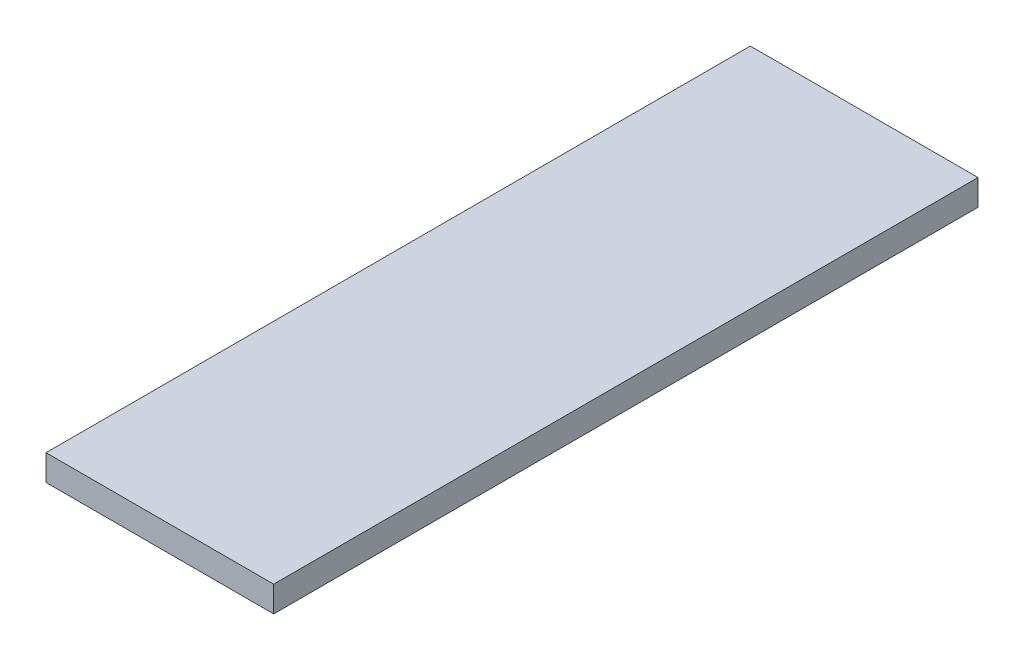
ISO-10303-21;
HEADER;
FILE_DESCRIPTION(('STEP AP214'),'2;1');
FILE_NAME('part.step','',(''),(''),'','','');
FILE_SCHEMA(('AUTOMOTIVE_DESIGN { 1 0 10303 214 1 1 1 1 }'));
ENDSEC;
DATA;
#1=APPLICATION_CONTEXT('core data for automotive mechanical design processes');
#2=APPLICATION_PROTOCOL_DEFINITION('international standard','automotive_design',2000,#1);
#3=PRODUCT_CONTEXT('',#1,'mechanical');
#4=PRODUCT('Part','Part','',(#3));
#5=PRODUCT_RELATED_PRODUCT_CATEGORY('part','',(#4));
#6=PRODUCT_DEFINITION_FORMATION('','',#4);
#7=PRODUCT_DEFINITION_CONTEXT('part definition',#1,'design');
#8=PRODUCT_DEFINITION('design','',#6,#7);
#9=PRODUCT_DEFINITION_SHAPE('','',#8);
#10=(LENGTH_UNIT() NAMED_UNIT(*) SI_UNIT(.MILLI.,.METRE.));
#11=(NAMED_UNIT(*) PLANE_ANGLE_UNIT() SI_UNIT($,.RADIAN.));
#12=(NAMED_UNIT(*) SI_UNIT($,.STERADIAN.) SOLID_ANGLE_UNIT());
#13=UNCERTAINTY_MEASURE_WITH_UNIT(LENGTH_MEASURE(1.E-05),#10,'distance_accuracy_value','');
#14=(GEOMETRIC_REPRESENTATION_CONTEXT(3) GLOBAL_UNCERTAINTY_ASSIGNED_CONTEXT((#13)) GLOBAL_UNIT_ASSIGNED_CONTEXT((#10,
#11,#12)) REPRESENTATION_CONTEXT('',''));
#15=CARTESIAN_POINT('',(0.,0.,0.));
#16=DIRECTION('',(0.,0.,1.));
#17=DIRECTION('',(1.,0.,0.));
#18=AXIS2_PLACEMENT_3D('',#15,#16,#17);
#19=CARTESIAN_POINT('',(0.,0.,0.));
#20=DIRECTION('',(0.,0.,-1.));
#21=DIRECTION('',(-1.,0.,0.));
#22=AXIS2_PLACEMENT_3D('',#19,#20,#21);
#23=PLANE('',#22);
#24=DIRECTION('',(0.,1.,0.));
#25=VECTOR('',#24,1.);
#26=CARTESIAN_POINT('',(230.,-383.5,0.));
#27=LINE('',#26,#25);
#28=CARTESIAN_POINT('',(230.,-400.5,0.));
#29=VERTEX_POINT('',#28);
#30=CARTESIAN_POINT('',(230.,-383.5,0.));
#31=VERTEX_POINT('',#30);
#32=EDGE_CURVE('E82',#29,#31,#27,.T.);
#33=ORIENTED_EDGE('',*,*,#32,.F.);
#34=DIRECTION('',(1.,0.,0.));
#35=VECTOR('',#34,1.);
#36=CARTESIAN_POINT('',(230.,-400.5,0.));
#37=LINE('',#36,#35);
#38=CARTESIAN_POINT('',(80.,-400.5,0.));
#39=VERTEX_POINT('',#38);
#40=EDGE_CURVE('E93',#39,#29,#37,.T.);
#41=ORIENTED_EDGE('',*,*,#40,.F.);
#42=DIRECTION('',(0.,-1.,0.));
#43=VECTOR('',#42,1.);
#44=CARTESIAN_POINT('',(79.9999999999999,-383.5,0.));
#45=LINE('',#44,#43);
#46=CARTESIAN_POINT('',(79.9999999999999,-383.5,0.));
#47=VERTEX_POINT('',#46);
#48=EDGE_CURVE('E84',#47,#39,#45,.T.);
#49=ORIENTED_EDGE('',*,*,#48,.F.);
#50=DIRECTION('',(-1.,0.,0.));
#51=VECTOR('',#50,1.);
#52=CARTESIAN_POINT('',(230.,-383.5,0.));
#53=LINE('',#52,#51);
#54=EDGE_CURVE('E74',#31,#47,#53,.T.);
#55=ORIENTED_EDGE('',*,*,#54,.F.);
#56=EDGE_LOOP('',(#33,#41,#49,#55));
#57=FACE_BOUND('',#56,.T.);
#58=ADVANCED_FACE('F33',(#57),#23,.T.);
#59=CARTESIAN_POINT('',(230.,-400.5,614.960259671213));
#60=DIRECTION('',(0.,1.,0.));
#61=DIRECTION('',(0.,0.,1.));
#62=AXIS2_PLACEMENT_3D('',#59,#60,#61);
#63=PLANE('',#62);
#64=DIRECTION('',(0.,0.,-1.));
#65=VECTOR('',#64,1.);
#66=CARTESIAN_POINT('',(230.,-400.5,614.960259671213));
#67=LINE('',#66,#65);
#68=CARTESIAN_POINT('',(230.,-400.5,464.));
#69=VERTEX_POINT('',#68);
#70=EDGE_CURVE('E87',#69,#29,#67,.T.);
#71=ORIENTED_EDGE('',*,*,#70,.F.);
#72=DIRECTION('',(-1.,0.,0.));
#73=VECTOR('',#72,1.);
#74=CARTESIAN_POINT('',(230.,-400.5,464.));
#75=LINE('',#74,#73);
#76=CARTESIAN_POINT('',(80.,-400.5,464.));
#77=VERTEX_POINT('',#76);
#78=EDGE_CURVE('E37',#69,#77,#75,.T.);
#79=ORIENTED_EDGE('',*,*,#78,.T.);
#80=DIRECTION('',(0.,0.,-1.));
#81=VECTOR('',#80,1.);
#82=CARTESIAN_POINT('',(80.,-400.5,614.960259671213));
#83=LINE('',#82,#81);
#84=EDGE_CURVE('E96',#77,#39,#83,.T.);
#85=ORIENTED_EDGE('',*,*,#84,.T.);
#86=ORIENTED_EDGE('',*,*,#40,.T.);
#87=EDGE_LOOP('',(#71,#79,#85,#86));
#88=FACE_BOUND('',#87,.T.);
#89=ADVANCED_FACE('F106',(#88),#63,.F.);
#90=CARTESIAN_POINT('',(79.9999999999999,-383.5,614.960259671213));
#91=DIRECTION('',(1.,0.,0.));
#92=DIRECTION('',(0.,1.,0.));
#93=AXIS2_PLACEMENT_3D('',#90,#91,#92);
#94=PLANE('',#93);
#95=ORIENTED_EDGE('',*,*,#84,.F.);
#96=DIRECTION('',(0.,1.,0.));
#97=VECTOR('',#96,1.);
#98=CARTESIAN_POINT('',(79.9999999999999,-383.5,464.));
#99=LINE('',#98,#97);
#100=CARTESIAN_POINT('',(79.9999999999999,-383.5,464.));
#101=VERTEX_POINT('',#100);
#102=EDGE_CURVE('E102',#77,#101,#99,.T.);
#103=ORIENTED_EDGE('',*,*,#102,.T.);
#104=DIRECTION('',(0.,0.,-1.));
#105=VECTOR('',#104,1.);
#106=CARTESIAN_POINT('',(79.9999999999999,-383.5,614.960259671213));
#107=LINE('',#106,#105);
#108=EDGE_CURVE('E78',#101,#47,#107,.T.);
#109=ORIENTED_EDGE('',*,*,#108,.T.);
#110=ORIENTED_EDGE('',*,*,#48,.T.);
#111=EDGE_LOOP('',(#95,#103,#109,#110));
#112=FACE_BOUND('',#111,.T.);
#113=ADVANCED_FACE('F101',(#112),#94,.F.);
#114=CARTESIAN_POINT('',(230.,-383.5,614.960259671213));
#115=DIRECTION('',(0.,-1.,0.));
#116=DIRECTION('',(0.,0.,-1.));
#117=AXIS2_PLACEMENT_3D('',#114,#115,#116);
#118=PLANE('',#117);
#119=ORIENTED_EDGE('',*,*,#108,.F.);
#120=DIRECTION('',(1.,0.,0.));
#121=VECTOR('',#120,1.);
#122=CARTESIAN_POINT('',(230.,-383.5,464.));
#123=LINE('',#122,#121);
#124=CARTESIAN_POINT('',(230.,-383.5,464.));
#125=VERTEX_POINT('',#124);
#126=EDGE_CURVE('E42',#101,#125,#123,.T.);
#127=ORIENTED_EDGE('',*,*,#126,.T.);
#128=DIRECTION('',(0.,0.,-1.));
#129=VECTOR('',#128,1.);
#130=CARTESIAN_POINT('',(230.,-383.5,614.960259671213));
#131=LINE('',#130,#129);
#132=EDGE_CURVE('E71',#125,#31,#131,.T.);
#133=ORIENTED_EDGE('',*,*,#132,.T.);
#134=ORIENTED_EDGE('',*,*,#54,.T.);
#135=EDGE_LOOP('',(#119,#127,#133,#134));
#136=FACE_BOUND('',#135,.T.);
#137=ADVANCED_FACE('F73',(#136),#118,.F.);
#138=CARTESIAN_POINT('',(230.,-383.5,614.960259671213));
#139=DIRECTION('',(-1.,0.,0.));
#140=DIRECTION('',(0.,0.,1.));
#141=AXIS2_PLACEMENT_3D('',#138,#139,#140);
#142=PLANE('',#141);
#143=ORIENTED_EDGE('',*,*,#132,.F.);
#144=DIRECTION('',(0.,-1.,0.));
#145=VECTOR('',#144,1.);
#146=CARTESIAN_POINT('',(230.,-383.5,464.));
#147=LINE('',#146,#145);
#148=EDGE_CURVE('E11',#125,#69,#147,.T.);
#149=ORIENTED_EDGE('',*,*,#148,.T.);
#150=ORIENTED_EDGE('',*,*,#70,.T.);
#151=ORIENTED_EDGE('',*,*,#32,.T.);
#152=EDGE_LOOP('',(#143,#149,#150,#151));
#153=FACE_BOUND('',#152,.T.);
#154=ADVANCED_FACE('F35',(#153),#142,.F.);
#155=CARTESIAN_POINT('',(5.00000000000007,-0.860495903996402,464.));
#156=DIRECTION('',(0.,0.,-1.));
#157=DIRECTION('',(-1.,0.,0.));
#158=AXIS2_PLACEMENT_3D('',#155,#156,#157);
#159=PLANE('',#158);
#160=ORIENTED_EDGE('',*,*,#126,.F.);
#161=ORIENTED_EDGE('',*,*,#102,.F.);
#162=ORIENTED_EDGE('',*,*,#78,.F.);
#163=ORIENTED_EDGE('',*,*,#148,.F.);
#164=EDGE_LOOP('',(#160,#161,#162,#163));
#165=FACE_BOUND('',#164,.T.);
#166=ADVANCED_FACE('F107',(#165),#159,.F.);
#167=CLOSED_SHELL('',(#58,#89,#113,#137,#154,#166));
#168=MANIFOLD_SOLID_BREP('B2',#167);
#169=ADVANCED_BREP_SHAPE_REPRESENTATION('',(#18,#168),#14);
#170=SHAPE_DEFINITION_REPRESENTATION(#9,#169);
ENDSEC;
END-ISO-10303-21;
